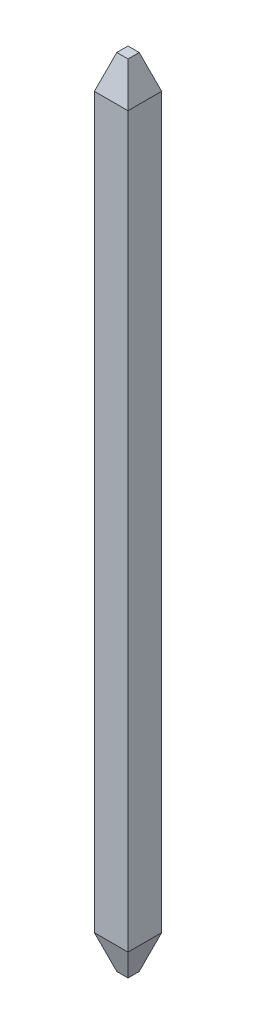
ISO-10303-21;
HEADER;
FILE_DESCRIPTION(('STEP AP214'),'2;1');
FILE_NAME('part.step','',(''),(''),'','','');
FILE_SCHEMA(('AUTOMOTIVE_DESIGN { 1 0 10303 214 1 1 1 1 }'));
ENDSEC;
DATA;
#1=APPLICATION_CONTEXT('core data for automotive mechanical design processes');
#2=APPLICATION_PROTOCOL_DEFINITION('international standard','automotive_design',2000,#1);
#3=PRODUCT_CONTEXT('',#1,'mechanical');
#4=PRODUCT('Part','Part','',(#3));
#5=PRODUCT_RELATED_PRODUCT_CATEGORY('part','',(#4));
#6=PRODUCT_DEFINITION_FORMATION('','',#4);
#7=PRODUCT_DEFINITION_CONTEXT('part definition',#1,'design');
#8=PRODUCT_DEFINITION('design','',#6,#7);
#9=PRODUCT_DEFINITION_SHAPE('','',#8);
#10=(LENGTH_UNIT() NAMED_UNIT(*) SI_UNIT(.MILLI.,.METRE.));
#11=(NAMED_UNIT(*) PLANE_ANGLE_UNIT() SI_UNIT($,.RADIAN.));
#12=(NAMED_UNIT(*) SI_UNIT($,.STERADIAN.) SOLID_ANGLE_UNIT());
#13=UNCERTAINTY_MEASURE_WITH_UNIT(LENGTH_MEASURE(1.E-05),#10,'distance_accuracy_value','');
#14=(GEOMETRIC_REPRESENTATION_CONTEXT(3) GLOBAL_UNCERTAINTY_ASSIGNED_CONTEXT((#13)) GLOBAL_UNIT_ASSIGNED_CONTEXT((#10,
#11,#12)) REPRESENTATION_CONTEXT('',''));
#15=CARTESIAN_POINT('',(0.,0.,0.));
#16=DIRECTION('',(0.,0.,1.));
#17=DIRECTION('',(1.,0.,0.));
#18=AXIS2_PLACEMENT_3D('',#15,#16,#17);
#19=CARTESIAN_POINT('',(0.3,14.2,-0.3));
#20=DIRECTION('',(-1.,0.,0.));
#21=DIRECTION('',(0.,0.,1.));
#22=AXIS2_PLACEMENT_3D('',#19,#20,#21);
#23=PLANE('',#22);
#24=DIRECTION('',(0.,-1.,0.));
#25=VECTOR('',#24,1.);
#26=CARTESIAN_POINT('',(0.3,14.2,0.3));
#27=LINE('',#26,#25);
#28=CARTESIAN_POINT('',(0.3,13.6,0.3));
#29=VERTEX_POINT('',#28);
#30=CARTESIAN_POINT('',(0.3,0.600000000000005,0.3));
#31=VERTEX_POINT('',#30);
#32=EDGE_CURVE('E145',#29,#31,#27,.T.);
#33=ORIENTED_EDGE('',*,*,#32,.T.);
#34=DIRECTION('',(0.,0.,-1.));
#35=VECTOR('',#34,1.);
#36=CARTESIAN_POINT('',(0.3,0.600000000000005,-0.3));
#37=LINE('',#36,#35);
#38=CARTESIAN_POINT('',(0.3,0.600000000000005,-0.3));
#39=VERTEX_POINT('',#38);
#40=EDGE_CURVE('E11',#31,#39,#37,.T.);
#41=ORIENTED_EDGE('',*,*,#40,.T.);
#42=DIRECTION('',(0.,-1.,0.));
#43=VECTOR('',#42,1.);
#44=CARTESIAN_POINT('',(0.3,14.2,-0.3));
#45=LINE('',#44,#43);
#46=CARTESIAN_POINT('',(0.3,13.6,-0.3));
#47=VERTEX_POINT('',#46);
#48=EDGE_CURVE('E122',#47,#39,#45,.T.);
#49=ORIENTED_EDGE('',*,*,#48,.F.);
#50=DIRECTION('',(0.,0.,1.));
#51=VECTOR('',#50,1.);
#52=CARTESIAN_POINT('',(0.3,13.6,0.3));
#53=LINE('',#52,#51);
#54=EDGE_CURVE('E135',#47,#29,#53,.T.);
#55=ORIENTED_EDGE('',*,*,#54,.T.);
#56=EDGE_LOOP('',(#33,#41,#49,#55));
#57=FACE_BOUND('',#56,.T.);
#58=ADVANCED_FACE('F34',(#57),#23,.F.);
#59=CARTESIAN_POINT('',(-0.3,14.2,-0.3));
#60=DIRECTION('',(0.,0.,1.));
#61=DIRECTION('',(1.,0.,0.));
#62=AXIS2_PLACEMENT_3D('',#59,#60,#61);
#63=PLANE('',#62);
#64=ORIENTED_EDGE('',*,*,#48,.T.);
#65=DIRECTION('',(-1.,0.,0.));
#66=VECTOR('',#65,1.);
#67=CARTESIAN_POINT('',(-0.3,0.600000000000005,-0.3));
#68=LINE('',#67,#66);
#69=CARTESIAN_POINT('',(-0.3,0.600000000000005,-0.3));
#70=VERTEX_POINT('',#69);
#71=EDGE_CURVE('E138',#39,#70,#68,.T.);
#72=ORIENTED_EDGE('',*,*,#71,.T.);
#73=DIRECTION('',(0.,-1.,0.));
#74=VECTOR('',#73,1.);
#75=CARTESIAN_POINT('',(-0.3,14.2,-0.3));
#76=LINE('',#75,#74);
#77=CARTESIAN_POINT('',(-0.3,13.6,-0.3));
#78=VERTEX_POINT('',#77);
#79=EDGE_CURVE('E188',#78,#70,#76,.T.);
#80=ORIENTED_EDGE('',*,*,#79,.F.);
#81=DIRECTION('',(1.,0.,0.));
#82=VECTOR('',#81,1.);
#83=CARTESIAN_POINT('',(0.3,13.6,-0.3));
#84=LINE('',#83,#82);
#85=EDGE_CURVE('E129',#78,#47,#84,.T.);
#86=ORIENTED_EDGE('',*,*,#85,.T.);
#87=EDGE_LOOP('',(#64,#72,#80,#86));
#88=FACE_BOUND('',#87,.T.);
#89=ADVANCED_FACE('F187',(#88),#63,.F.);
#90=CARTESIAN_POINT('',(-0.3,14.2,-0.3));
#91=DIRECTION('',(1.,0.,0.));
#92=DIRECTION('',(0.,0.,-1.));
#93=AXIS2_PLACEMENT_3D('',#90,#91,#92);
#94=PLANE('',#93);
#95=ORIENTED_EDGE('',*,*,#79,.T.);
#96=DIRECTION('',(0.,0.,1.));
#97=VECTOR('',#96,1.);
#98=CARTESIAN_POINT('',(-0.3,0.600000000000005,-0.3));
#99=LINE('',#98,#97);
#100=CARTESIAN_POINT('',(-0.3,0.600000000000005,0.3));
#101=VERTEX_POINT('',#100);
#102=EDGE_CURVE('E58',#70,#101,#99,.T.);
#103=ORIENTED_EDGE('',*,*,#102,.T.);
#104=DIRECTION('',(0.,-1.,0.));
#105=VECTOR('',#104,1.);
#106=CARTESIAN_POINT('',(-0.3,14.2,0.3));
#107=LINE('',#106,#105);
#108=CARTESIAN_POINT('',(-0.3,13.6,0.3));
#109=VERTEX_POINT('',#108);
#110=EDGE_CURVE('E191',#109,#101,#107,.T.);
#111=ORIENTED_EDGE('',*,*,#110,.F.);
#112=DIRECTION('',(0.,0.,-1.));
#113=VECTOR('',#112,1.);
#114=CARTESIAN_POINT('',(-0.3,13.6,-0.3));
#115=LINE('',#114,#113);
#116=EDGE_CURVE('E109',#109,#78,#115,.T.);
#117=ORIENTED_EDGE('',*,*,#116,.T.);
#118=EDGE_LOOP('',(#95,#103,#111,#117));
#119=FACE_BOUND('',#118,.T.);
#120=ADVANCED_FACE('F190',(#119),#94,.F.);
#121=CARTESIAN_POINT('',(-0.3,14.2,0.3));
#122=DIRECTION('',(0.,0.,-1.));
#123=DIRECTION('',(-1.,0.,0.));
#124=AXIS2_PLACEMENT_3D('',#121,#122,#123);
#125=PLANE('',#124);
#126=ORIENTED_EDGE('',*,*,#110,.T.);
#127=DIRECTION('',(1.,0.,0.));
#128=VECTOR('',#127,1.);
#129=CARTESIAN_POINT('',(-0.3,0.600000000000005,0.3));
#130=LINE('',#129,#128);
#131=EDGE_CURVE('E43',#101,#31,#130,.T.);
#132=ORIENTED_EDGE('',*,*,#131,.T.);
#133=ORIENTED_EDGE('',*,*,#32,.F.);
#134=DIRECTION('',(-1.,0.,0.));
#135=VECTOR('',#134,1.);
#136=CARTESIAN_POINT('',(-0.3,13.6,0.3));
#137=LINE('',#136,#135);
#138=EDGE_CURVE('E137',#29,#109,#137,.T.);
#139=ORIENTED_EDGE('',*,*,#138,.T.);
#140=EDGE_LOOP('',(#126,#132,#133,#139));
#141=FACE_BOUND('',#140,.T.);
#142=ADVANCED_FACE('F204',(#141),#125,.F.);
#143=CARTESIAN_POINT('',(0.,14.2,0.));
#144=DIRECTION('',(0.,1.,0.));
#145=DIRECTION('',(0.,0.,1.));
#146=AXIS2_PLACEMENT_3D('',#143,#144,#145);
#147=PLANE('',#146);
#148=DIRECTION('',(-1.,0.,0.));
#149=VECTOR('',#148,1.);
#150=CARTESIAN_POINT('',(-0.3,14.2,-0.1));
#151=LINE('',#150,#149);
#152=CARTESIAN_POINT('',(0.1,14.2,-0.1));
#153=VERTEX_POINT('',#152);
#154=CARTESIAN_POINT('',(-0.1,14.2,-0.1));
#155=VERTEX_POINT('',#154);
#156=EDGE_CURVE('E126',#153,#155,#151,.T.);
#157=ORIENTED_EDGE('',*,*,#156,.T.);
#158=DIRECTION('',(0.,0.,1.));
#159=VECTOR('',#158,1.);
#160=CARTESIAN_POINT('',(-0.1,14.2,0.3));
#161=LINE('',#160,#159);
#162=CARTESIAN_POINT('',(-0.1,14.2,0.1));
#163=VERTEX_POINT('',#162);
#164=EDGE_CURVE('E107',#155,#163,#161,.T.);
#165=ORIENTED_EDGE('',*,*,#164,.T.);
#166=DIRECTION('',(1.,0.,0.));
#167=VECTOR('',#166,1.);
#168=CARTESIAN_POINT('',(0.3,14.2,0.1));
#169=LINE('',#168,#167);
#170=CARTESIAN_POINT('',(0.1,14.2,0.1));
#171=VERTEX_POINT('',#170);
#172=EDGE_CURVE('E115',#163,#171,#169,.T.);
#173=ORIENTED_EDGE('',*,*,#172,.T.);
#174=DIRECTION('',(0.,0.,-1.));
#175=VECTOR('',#174,1.);
#176=CARTESIAN_POINT('',(0.1,14.2,-0.3));
#177=LINE('',#176,#175);
#178=EDGE_CURVE('E121',#171,#153,#177,.T.);
#179=ORIENTED_EDGE('',*,*,#178,.T.);
#180=EDGE_LOOP('',(#157,#165,#173,#179));
#181=FACE_BOUND('',#180,.T.);
#182=ADVANCED_FACE('F124',(#181),#147,.T.);
#183=CARTESIAN_POINT('',(0.,0.,0.));
#184=DIRECTION('',(0.,1.,0.));
#185=DIRECTION('',(0.,0.,1.));
#186=AXIS2_PLACEMENT_3D('',#183,#184,#185);
#187=PLANE('',#186);
#188=DIRECTION('',(0.,0.,-1.));
#189=VECTOR('',#188,1.);
#190=CARTESIAN_POINT('',(-0.1,0.,0.));
#191=LINE('',#190,#189);
#192=CARTESIAN_POINT('',(-0.1,0.,0.1));
#193=VERTEX_POINT('',#192);
#194=CARTESIAN_POINT('',(-0.1,0.,-0.1));
#195=VERTEX_POINT('',#194);
#196=EDGE_CURVE('E152',#193,#195,#191,.T.);
#197=ORIENTED_EDGE('',*,*,#196,.T.);
#198=DIRECTION('',(1.,0.,0.));
#199=VECTOR('',#198,1.);
#200=CARTESIAN_POINT('',(0.,0.,-0.1));
#201=LINE('',#200,#199);
#202=CARTESIAN_POINT('',(0.1,0.,-0.1));
#203=VERTEX_POINT('',#202);
#204=EDGE_CURVE('E154',#195,#203,#201,.T.);
#205=ORIENTED_EDGE('',*,*,#204,.T.);
#206=DIRECTION('',(0.,0.,1.));
#207=VECTOR('',#206,1.);
#208=CARTESIAN_POINT('',(0.1,0.,0.));
#209=LINE('',#208,#207);
#210=CARTESIAN_POINT('',(0.1,0.,0.1));
#211=VERTEX_POINT('',#210);
#212=EDGE_CURVE('E148',#203,#211,#209,.T.);
#213=ORIENTED_EDGE('',*,*,#212,.T.);
#214=DIRECTION('',(-1.,0.,0.));
#215=VECTOR('',#214,1.);
#216=CARTESIAN_POINT('',(0.,0.,0.1));
#217=LINE('',#216,#215);
#218=EDGE_CURVE('E150',#211,#193,#217,.T.);
#219=ORIENTED_EDGE('',*,*,#218,.T.);
#220=EDGE_LOOP('',(#197,#205,#213,#219));
#221=FACE_BOUND('',#220,.T.);
#222=ADVANCED_FACE('F177',(#221),#187,.F.);
#223=CARTESIAN_POINT('',(0.1,14.2,0.));
#224=DIRECTION('',(0.948683298050515,0.316227766016834,0.));
#225=DIRECTION('',(0.,0.,1.));
#226=AXIS2_PLACEMENT_3D('',#223,#224,#225);
#227=PLANE('',#226);
#228=DIRECTION('',(-0.30151134457776,0.904534033733293,-0.30151134457776));
#229=VECTOR('',#228,1.);
#230=CARTESIAN_POINT('',(0.0909090909090914,14.2272727272727,0.0909090909090914));
#231=LINE('',#230,#229);
#232=EDGE_CURVE('E118',#29,#171,#231,.T.);
#233=ORIENTED_EDGE('',*,*,#232,.F.);
#234=ORIENTED_EDGE('',*,*,#54,.F.);
#235=DIRECTION('',(-0.30151134457776,0.904534033733293,0.30151134457776));
#236=VECTOR('',#235,1.);
#237=CARTESIAN_POINT('',(0.0909090909090914,14.2272727272727,-0.0909090909090914));
#238=LINE('',#237,#236);
#239=EDGE_CURVE('E142',#153,#47,#238,.F.);
#240=ORIENTED_EDGE('',*,*,#239,.F.);
#241=ORIENTED_EDGE('',*,*,#178,.F.);
#242=EDGE_LOOP('',(#233,#234,#240,#241));
#243=FACE_BOUND('',#242,.T.);
#244=ADVANCED_FACE('F199',(#243),#227,.T.);
#245=CARTESIAN_POINT('',(0.,14.2,-0.1));
#246=DIRECTION('',(0.,0.316227766016834,-0.948683298050515));
#247=DIRECTION('',(1.,0.,0.));
#248=AXIS2_PLACEMENT_3D('',#245,#246,#247);
#249=PLANE('',#248);
#250=ORIENTED_EDGE('',*,*,#239,.T.);
#251=ORIENTED_EDGE('',*,*,#85,.F.);
#252=DIRECTION('',(0.30151134457776,0.904534033733293,0.30151134457776));
#253=VECTOR('',#252,1.);
#254=CARTESIAN_POINT('',(-0.0909090909090914,14.2272727272727,-0.0909090909090914));
#255=LINE('',#254,#253);
#256=EDGE_CURVE('E112',#155,#78,#255,.F.);
#257=ORIENTED_EDGE('',*,*,#256,.F.);
#258=ORIENTED_EDGE('',*,*,#156,.F.);
#259=EDGE_LOOP('',(#250,#251,#257,#258));
#260=FACE_BOUND('',#259,.T.);
#261=ADVANCED_FACE('F202',(#260),#249,.T.);
#262=CARTESIAN_POINT('',(0.,14.2,0.1));
#263=DIRECTION('',(0.,0.316227766016834,0.948683298050515));
#264=DIRECTION('',(-1.,0.,0.));
#265=AXIS2_PLACEMENT_3D('',#262,#263,#264);
#266=PLANE('',#265);
#267=ORIENTED_EDGE('',*,*,#232,.T.);
#268=ORIENTED_EDGE('',*,*,#172,.F.);
#269=DIRECTION('',(-0.30151134457776,-0.904534033733293,0.30151134457776));
#270=VECTOR('',#269,1.);
#271=CARTESIAN_POINT('',(-0.0909090909090914,14.2272727272727,0.0909090909090914));
#272=LINE('',#271,#270);
#273=EDGE_CURVE('E103',#109,#163,#272,.F.);
#274=ORIENTED_EDGE('',*,*,#273,.F.);
#275=ORIENTED_EDGE('',*,*,#138,.F.);
#276=EDGE_LOOP('',(#267,#268,#274,#275));
#277=FACE_BOUND('',#276,.T.);
#278=ADVANCED_FACE('F116',(#277),#266,.T.);
#279=CARTESIAN_POINT('',(-0.1,14.2,0.));
#280=DIRECTION('',(-0.948683298050515,0.316227766016834,0.));
#281=DIRECTION('',(0.,0.,-1.));
#282=AXIS2_PLACEMENT_3D('',#279,#280,#281);
#283=PLANE('',#282);
#284=ORIENTED_EDGE('',*,*,#256,.T.);
#285=ORIENTED_EDGE('',*,*,#116,.F.);
#286=ORIENTED_EDGE('',*,*,#273,.T.);
#287=ORIENTED_EDGE('',*,*,#164,.F.);
#288=EDGE_LOOP('',(#284,#285,#286,#287));
#289=FACE_BOUND('',#288,.T.);
#290=ADVANCED_FACE('F105',(#289),#283,.T.);
#291=CARTESIAN_POINT('',(-0.3,0.600000000000005,0.3));
#292=DIRECTION('',(0.,0.316227766016835,-0.948683298050515));
#293=DIRECTION('',(1.,0.,0.));
#294=AXIS2_PLACEMENT_3D('',#291,#292,#293);
#295=PLANE('',#294);
#296=DIRECTION('',(0.301511344577761,-0.904534033733292,-0.301511344577761));
#297=VECTOR('',#296,1.);
#298=CARTESIAN_POINT('',(-0.3,0.600000000000005,0.3));
#299=LINE('',#298,#297);
#300=EDGE_CURVE('E162',#193,#101,#299,.F.);
#301=ORIENTED_EDGE('',*,*,#300,.F.);
#302=ORIENTED_EDGE('',*,*,#218,.F.);
#303=DIRECTION('',(-0.301511344577761,-0.904534033733292,-0.301511344577761));
#304=VECTOR('',#303,1.);
#305=CARTESIAN_POINT('',(0.245454545454546,0.436363636363643,0.245454545454546));
#306=LINE('',#305,#304);
#307=EDGE_CURVE('E38',#31,#211,#306,.T.);
#308=ORIENTED_EDGE('',*,*,#307,.F.);
#309=ORIENTED_EDGE('',*,*,#131,.F.);
#310=EDGE_LOOP('',(#301,#302,#308,#309));
#311=FACE_BOUND('',#310,.T.);
#312=ADVANCED_FACE('F36',(#311),#295,.F.);
#313=CARTESIAN_POINT('',(0.3,0.600000000000005,-0.3));
#314=DIRECTION('',(-0.948683298050515,0.316227766016835,0.));
#315=DIRECTION('',(0.,0.,-1.));
#316=AXIS2_PLACEMENT_3D('',#313,#314,#315);
#317=PLANE('',#316);
#318=ORIENTED_EDGE('',*,*,#307,.T.);
#319=ORIENTED_EDGE('',*,*,#212,.F.);
#320=DIRECTION('',(0.301511344577761,0.904534033733292,-0.301511344577761));
#321=VECTOR('',#320,1.);
#322=CARTESIAN_POINT('',(0.3,0.600000000000005,-0.3));
#323=LINE('',#322,#321);
#324=EDGE_CURVE('E161',#39,#203,#323,.F.);
#325=ORIENTED_EDGE('',*,*,#324,.F.);
#326=ORIENTED_EDGE('',*,*,#40,.F.);
#327=EDGE_LOOP('',(#318,#319,#325,#326));
#328=FACE_BOUND('',#327,.T.);
#329=ADVANCED_FACE('F172',(#328),#317,.F.);
#330=CARTESIAN_POINT('',(-0.3,0.600000000000005,-0.3));
#331=DIRECTION('',(0.948683298050515,0.316227766016835,0.));
#332=DIRECTION('',(0.,0.,1.));
#333=AXIS2_PLACEMENT_3D('',#330,#331,#332);
#334=PLANE('',#333);
#335=ORIENTED_EDGE('',*,*,#300,.T.);
#336=ORIENTED_EDGE('',*,*,#102,.F.);
#337=DIRECTION('',(0.301511344577761,-0.904534033733292,0.301511344577761));
#338=VECTOR('',#337,1.);
#339=CARTESIAN_POINT('',(-0.3,0.600000000000005,-0.3));
#340=LINE('',#339,#338);
#341=EDGE_CURVE('E159',#195,#70,#340,.F.);
#342=ORIENTED_EDGE('',*,*,#341,.F.);
#343=ORIENTED_EDGE('',*,*,#196,.F.);
#344=EDGE_LOOP('',(#335,#336,#342,#343));
#345=FACE_BOUND('',#344,.T.);
#346=ADVANCED_FACE('F183',(#345),#334,.F.);
#347=CARTESIAN_POINT('',(-0.3,0.600000000000005,-0.3));
#348=DIRECTION('',(0.,0.316227766016835,0.948683298050515));
#349=DIRECTION('',(-1.,0.,0.));
#350=AXIS2_PLACEMENT_3D('',#347,#348,#349);
#351=PLANE('',#350);
#352=ORIENTED_EDGE('',*,*,#324,.T.);
#353=ORIENTED_EDGE('',*,*,#204,.F.);
#354=ORIENTED_EDGE('',*,*,#341,.T.);
#355=ORIENTED_EDGE('',*,*,#71,.F.);
#356=EDGE_LOOP('',(#352,#353,#354,#355));
#357=FACE_BOUND('',#356,.T.);
#358=ADVANCED_FACE('F181',(#357),#351,.F.);
#359=CLOSED_SHELL('',(#58,#89,#120,#142,#182,#222,#244,#261,#278,#290,#312,#329,#346,#358));
#360=MANIFOLD_SOLID_BREP('B2',#359);
#361=ADVANCED_BREP_SHAPE_REPRESENTATION('',(#18,#360),#14);
#362=SHAPE_DEFINITION_REPRESENTATION(#9,#361);
ENDSEC;
END-ISO-10303-21;
